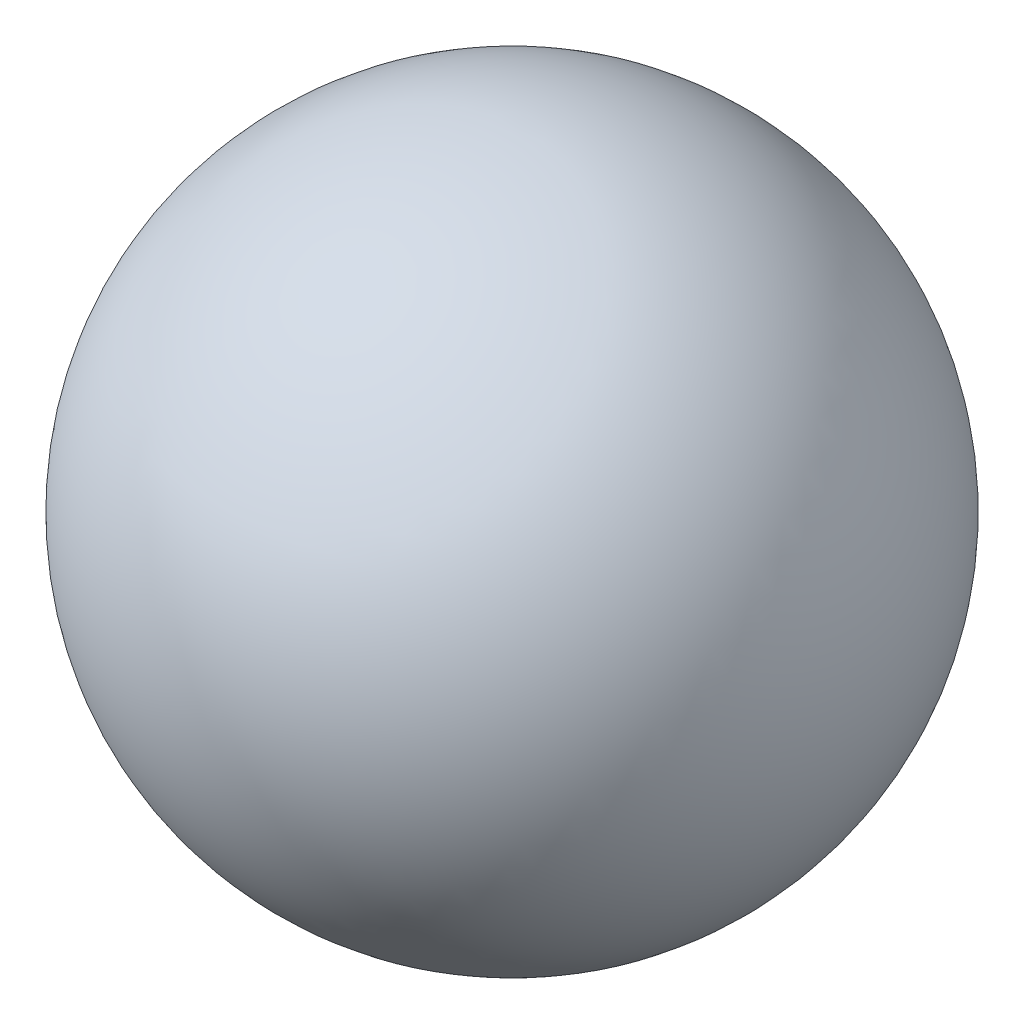
ISO-10303-21;
HEADER;
FILE_DESCRIPTION(('STEP AP214'),'2;1');
FILE_NAME('part.step','',(''),(''),'','','');
FILE_SCHEMA(('AUTOMOTIVE_DESIGN { 1 0 10303 214 1 1 1 1 }'));
ENDSEC;
DATA;
#1=APPLICATION_CONTEXT('core data for automotive mechanical design processes');
#2=APPLICATION_PROTOCOL_DEFINITION('international standard','automotive_design',2000,#1);
#3=PRODUCT_CONTEXT('',#1,'mechanical');
#4=PRODUCT('Part','Part','',(#3));
#5=PRODUCT_RELATED_PRODUCT_CATEGORY('part','',(#4));
#6=PRODUCT_DEFINITION_FORMATION('','',#4);
#7=PRODUCT_DEFINITION_CONTEXT('part definition',#1,'design');
#8=PRODUCT_DEFINITION('design','',#6,#7);
#9=PRODUCT_DEFINITION_SHAPE('','',#8);
#10=(LENGTH_UNIT() NAMED_UNIT(*) SI_UNIT(.MILLI.,.METRE.));
#11=(NAMED_UNIT(*) PLANE_ANGLE_UNIT() SI_UNIT($,.RADIAN.));
#12=(NAMED_UNIT(*) SI_UNIT($,.STERADIAN.) SOLID_ANGLE_UNIT());
#13=UNCERTAINTY_MEASURE_WITH_UNIT(LENGTH_MEASURE(1.E-05),#10,'distance_accuracy_value','');
#14=(GEOMETRIC_REPRESENTATION_CONTEXT(3) GLOBAL_UNCERTAINTY_ASSIGNED_CONTEXT((#13)) GLOBAL_UNIT_ASSIGNED_CONTEXT((#10,
#11,#12)) REPRESENTATION_CONTEXT('',''));
#15=CARTESIAN_POINT('',(0.,0.,0.));
#16=DIRECTION('',(0.,0.,1.));
#17=DIRECTION('',(1.,0.,0.));
#18=AXIS2_PLACEMENT_3D('',#15,#16,#17);
#19=CARTESIAN_POINT('',(0.,0.,0.));
#20=DIRECTION('',(0.,1.,0.));
#21=DIRECTION('',(1.,0.,0.));
#22=AXIS2_PLACEMENT_3D('',#19,#20,#21);
#23=SPHERICAL_SURFACE('',#22,1.75);
#24=CARTESIAN_POINT('',(0.,1.75,0.));
#25=VERTEX_POINT('',#24);
#26=VERTEX_LOOP('',#25);
#27=FACE_BOUND('',#26,.T.);
#28=ADVANCED_FACE('F39',(#27),#23,.T.);
#29=CLOSED_SHELL('',(#28));
#30=MANIFOLD_SOLID_BREP('B2',#29);
#31=ADVANCED_BREP_SHAPE_REPRESENTATION('',(#18,#30),#14);
#32=SHAPE_DEFINITION_REPRESENTATION(#9,#31);
ENDSEC;
END-ISO-10303-21;
